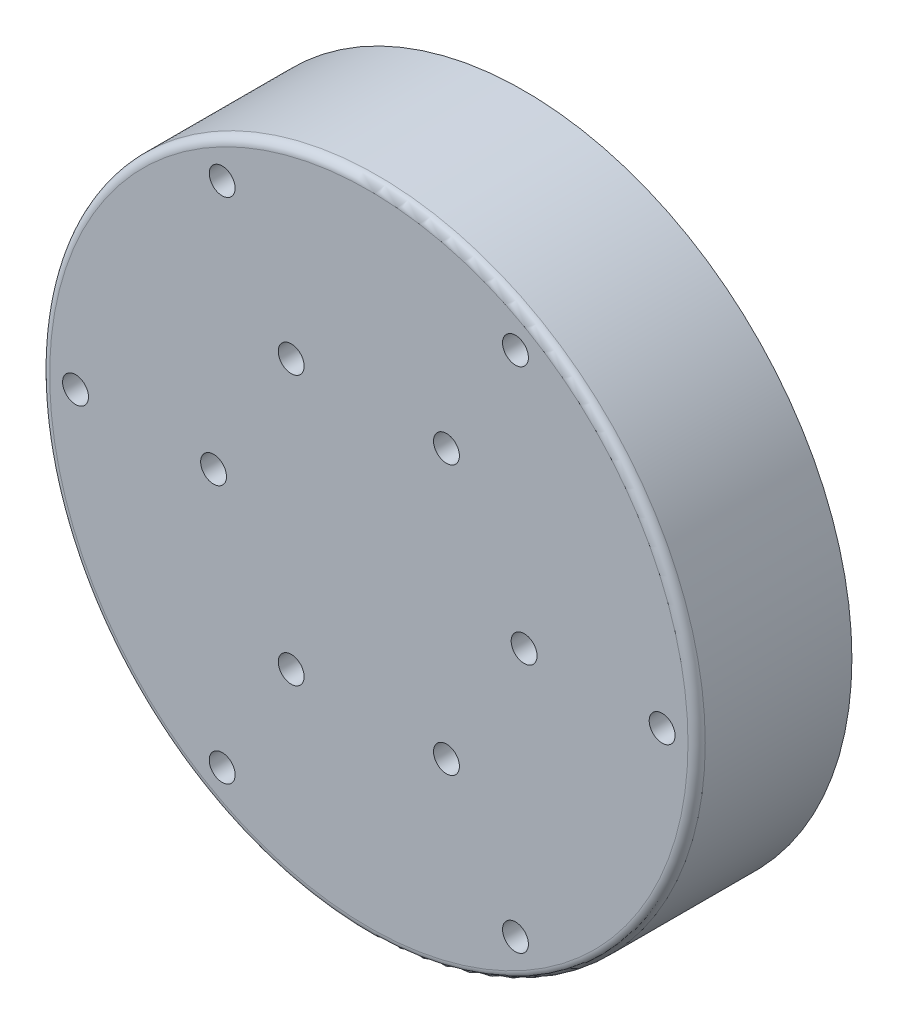
ISO-10303-21;
HEADER;
FILE_DESCRIPTION(('STEP AP214'),'2;1');
FILE_NAME('part.step','',(''),(''),'','','');
FILE_SCHEMA(('AUTOMOTIVE_DESIGN { 1 0 10303 214 1 1 1 1 }'));
ENDSEC;
DATA;
#1=APPLICATION_CONTEXT('core data for automotive mechanical design processes');
#2=APPLICATION_PROTOCOL_DEFINITION('international standard','automotive_design',2000,#1);
#3=PRODUCT_CONTEXT('',#1,'mechanical');
#4=PRODUCT('Part','Part','',(#3));
#5=PRODUCT_RELATED_PRODUCT_CATEGORY('part','',(#4));
#6=PRODUCT_DEFINITION_FORMATION('','',#4);
#7=PRODUCT_DEFINITION_CONTEXT('part definition',#1,'design');
#8=PRODUCT_DEFINITION('design','',#6,#7);
#9=PRODUCT_DEFINITION_SHAPE('','',#8);
#10=(LENGTH_UNIT() NAMED_UNIT(*) SI_UNIT(.MILLI.,.METRE.));
#11=(NAMED_UNIT(*) PLANE_ANGLE_UNIT() SI_UNIT($,.RADIAN.));
#12=(NAMED_UNIT(*) SI_UNIT($,.STERADIAN.) SOLID_ANGLE_UNIT());
#13=UNCERTAINTY_MEASURE_WITH_UNIT(LENGTH_MEASURE(1.E-05),#10,'distance_accuracy_value','');
#14=(GEOMETRIC_REPRESENTATION_CONTEXT(3) GLOBAL_UNCERTAINTY_ASSIGNED_CONTEXT((#13)) GLOBAL_UNIT_ASSIGNED_CONTEXT((#10,
#11,#12)) REPRESENTATION_CONTEXT('',''));
#15=CARTESIAN_POINT('',(0.,0.,0.));
#16=DIRECTION('',(0.,0.,1.));
#17=DIRECTION('',(1.,0.,0.));
#18=AXIS2_PLACEMENT_3D('',#15,#16,#17);
#19=CARTESIAN_POINT('',(0.,0.,18.));
#20=DIRECTION('',(0.,0.,-1.));
#21=DIRECTION('',(-1.,0.,0.));
#22=AXIS2_PLACEMENT_3D('',#19,#20,#21);
#23=CYLINDRICAL_SURFACE('',#22,38.);
#24=CARTESIAN_POINT('',(0.,0.,12.5));
#25=DIRECTION('',(0.,0.,1.));
#26=DIRECTION('',(1.,0.,0.));
#27=AXIS2_PLACEMENT_3D('',#24,#25,#26);
#28=CIRCLE('',#27,38.);
#29=CARTESIAN_POINT('',(10.,-36.6606055596467,12.5));
#30=VERTEX_POINT('',#29);
#31=CARTESIAN_POINT('',(-10.,-36.6606055596467,12.5));
#32=VERTEX_POINT('',#31);
#33=EDGE_CURVE('E110',#30,#32,#28,.F.);
#34=ORIENTED_EDGE('',*,*,#33,.F.);
#35=DIRECTION('',(0.,0.,-1.));
#36=VECTOR('',#35,1.);
#37=CARTESIAN_POINT('',(10.,-36.6606055596467,18.));
#38=LINE('',#37,#36);
#39=CARTESIAN_POINT('',(10.,-36.6606055596467,8.5));
#40=VERTEX_POINT('',#39);
#41=EDGE_CURVE('E92',#40,#30,#38,.F.);
#42=ORIENTED_EDGE('',*,*,#41,.F.);
#43=CARTESIAN_POINT('',(0.,0.,8.49999999999999));
#44=DIRECTION('',(0.,0.,-1.));
#45=DIRECTION('',(-1.,0.,0.));
#46=AXIS2_PLACEMENT_3D('',#43,#44,#45);
#47=CIRCLE('',#46,38.);
#48=CARTESIAN_POINT('',(-10.,-36.6606055596467,8.49999999999999));
#49=VERTEX_POINT('',#48);
#50=EDGE_CURVE('E102',#49,#40,#47,.F.);
#51=ORIENTED_EDGE('',*,*,#50,.F.);
#52=DIRECTION('',(0.,0.,-1.));
#53=VECTOR('',#52,1.);
#54=CARTESIAN_POINT('',(-10.,-36.6606055596467,18.));
#55=LINE('',#54,#53);
#56=EDGE_CURVE('E51',#32,#49,#55,.T.);
#57=ORIENTED_EDGE('',*,*,#56,.F.);
#58=EDGE_LOOP('',(#34,#42,#51,#57));
#59=FACE_BOUND('',#58,.T.);
#60=CARTESIAN_POINT('',(0.,0.,17.));
#61=DIRECTION('',(0.,0.,1.));
#62=DIRECTION('',(1.,0.,0.));
#63=AXIS2_PLACEMENT_3D('',#60,#61,#62);
#64=CIRCLE('',#63,38.);
#65=CARTESIAN_POINT('',(38.,0.,17.));
#66=VERTEX_POINT('',#65);
#67=EDGE_CURVE('E11',#66,#66,#64,.F.);
#68=ORIENTED_EDGE('',*,*,#67,.T.);
#69=EDGE_LOOP('',(#68));
#70=FACE_BOUND('',#69,.T.);
#71=CARTESIAN_POINT('',(0.,0.,0.));
#72=DIRECTION('',(0.,0.,1.));
#73=DIRECTION('',(1.,0.,0.));
#74=AXIS2_PLACEMENT_3D('',#71,#72,#73);
#75=CIRCLE('',#74,38.);
#76=CARTESIAN_POINT('',(38.,0.,0.));
#77=VERTEX_POINT('',#76);
#78=EDGE_CURVE('E147',#77,#77,#75,.T.);
#79=ORIENTED_EDGE('',*,*,#78,.T.);
#80=EDGE_LOOP('',(#79));
#81=FACE_BOUND('',#80,.T.);
#82=ADVANCED_FACE('F36',(#59,#70,#81),#23,.T.);
#83=CARTESIAN_POINT('',(0.,0.,18.));
#84=DIRECTION('',(0.,0.,1.));
#85=DIRECTION('',(1.,0.,0.));
#86=AXIS2_PLACEMENT_3D('',#83,#84,#85);
#87=PLANE('',#86);
#88=CARTESIAN_POINT('',(-18.,0.,18.));
#89=DIRECTION('',(0.,0.,1.));
#90=DIRECTION('',(1.,0.,0.));
#91=AXIS2_PLACEMENT_3D('',#88,#89,#90);
#92=CIRCLE('',#91,1.5);
#93=CARTESIAN_POINT('',(-16.5,0.,18.));
#94=VERTEX_POINT('',#93);
#95=EDGE_CURVE('E273',#94,#94,#92,.T.);
#96=ORIENTED_EDGE('',*,*,#95,.F.);
#97=EDGE_LOOP('',(#96));
#98=FACE_BOUND('',#97,.T.);
#99=CARTESIAN_POINT('',(-9.00000000000018,-15.5884572681198,18.));
#100=DIRECTION('',(0.,0.,1.));
#101=DIRECTION('',(1.,0.,0.));
#102=AXIS2_PLACEMENT_3D('',#99,#100,#101);
#103=CIRCLE('',#102,1.5);
#104=CARTESIAN_POINT('',(-7.50000000000018,-15.5884572681198,18.));
#105=VERTEX_POINT('',#104);
#106=EDGE_CURVE('E278',#105,#105,#103,.T.);
#107=ORIENTED_EDGE('',*,*,#106,.F.);
#108=EDGE_LOOP('',(#107));
#109=FACE_BOUND('',#108,.T.);
#110=CARTESIAN_POINT('',(8.99999999999985,-15.58845726812,18.));
#111=DIRECTION('',(0.,0.,1.));
#112=DIRECTION('',(1.,0.,0.));
#113=AXIS2_PLACEMENT_3D('',#110,#111,#112);
#114=CIRCLE('',#113,1.5);
#115=CARTESIAN_POINT('',(10.4999999999999,-15.58845726812,18.));
#116=VERTEX_POINT('',#115);
#117=EDGE_CURVE('E302',#116,#116,#114,.T.);
#118=ORIENTED_EDGE('',*,*,#117,.F.);
#119=EDGE_LOOP('',(#118));
#120=FACE_BOUND('',#119,.T.);
#121=CARTESIAN_POINT('',(18.,-1.25693328198353E-13,18.));
#122=DIRECTION('',(0.,0.,1.));
#123=DIRECTION('',(1.,0.,0.));
#124=AXIS2_PLACEMENT_3D('',#121,#122,#123);
#125=CIRCLE('',#124,1.5);
#126=CARTESIAN_POINT('',(19.5,-1.25693328198353E-13,18.));
#127=VERTEX_POINT('',#126);
#128=EDGE_CURVE('E296',#127,#127,#125,.T.);
#129=ORIENTED_EDGE('',*,*,#128,.F.);
#130=EDGE_LOOP('',(#129));
#131=FACE_BOUND('',#130,.T.);
#132=CARTESIAN_POINT('',(9.00000000000007,15.5884572681199,18.));
#133=DIRECTION('',(0.,0.,1.));
#134=DIRECTION('',(1.,0.,0.));
#135=AXIS2_PLACEMENT_3D('',#132,#133,#134);
#136=CIRCLE('',#135,1.5);
#137=CARTESIAN_POINT('',(10.5000000000001,15.5884572681199,18.));
#138=VERTEX_POINT('',#137);
#139=EDGE_CURVE('E290',#138,#138,#136,.T.);
#140=ORIENTED_EDGE('',*,*,#139,.F.);
#141=EDGE_LOOP('',(#140));
#142=FACE_BOUND('',#141,.T.);
#143=CARTESIAN_POINT('',(-8.99999999999996,15.5884572681199,18.));
#144=DIRECTION('',(0.,0.,1.));
#145=DIRECTION('',(1.,0.,0.));
#146=AXIS2_PLACEMENT_3D('',#143,#144,#145);
#147=CIRCLE('',#146,1.5);
#148=CARTESIAN_POINT('',(-7.49999999999996,15.5884572681199,18.));
#149=VERTEX_POINT('',#148);
#150=EDGE_CURVE('E275',#149,#149,#147,.T.);
#151=ORIENTED_EDGE('',*,*,#150,.F.);
#152=EDGE_LOOP('',(#151));
#153=FACE_BOUND('',#152,.T.);
#154=CARTESIAN_POINT('',(0.,0.,18.));
#155=DIRECTION('',(0.,0.,1.));
#156=DIRECTION('',(1.,0.,0.));
#157=AXIS2_PLACEMENT_3D('',#154,#155,#156);
#158=CIRCLE('',#157,37.);
#159=CARTESIAN_POINT('',(37.,0.,18.));
#160=VERTEX_POINT('',#159);
#161=EDGE_CURVE('E44',#160,#160,#158,.T.);
#162=ORIENTED_EDGE('',*,*,#161,.T.);
#163=EDGE_LOOP('',(#162));
#164=FACE_BOUND('',#163,.T.);
#165=CARTESIAN_POINT('',(34.,-2.37420731041333E-13,18.));
#166=DIRECTION('',(0.,0.,1.));
#167=DIRECTION('',(1.,0.,0.));
#168=AXIS2_PLACEMENT_3D('',#165,#166,#167);
#169=CIRCLE('',#168,1.5);
#170=CARTESIAN_POINT('',(35.5,-2.37420731041333E-13,18.));
#171=VERTEX_POINT('',#170);
#172=EDGE_CURVE('E140',#171,#171,#169,.T.);
#173=ORIENTED_EDGE('',*,*,#172,.F.);
#174=EDGE_LOOP('',(#173));
#175=FACE_BOUND('',#174,.T.);
#176=CARTESIAN_POINT('',(16.9999999999997,-29.4448637286711,18.));
#177=DIRECTION('',(0.,0.,1.));
#178=DIRECTION('',(1.,0.,0.));
#179=AXIS2_PLACEMENT_3D('',#176,#177,#178);
#180=CIRCLE('',#179,1.5);
#181=CARTESIAN_POINT('',(18.4999999999997,-29.4448637286711,18.));
#182=VERTEX_POINT('',#181);
#183=EDGE_CURVE('E150',#182,#182,#180,.T.);
#184=ORIENTED_EDGE('',*,*,#183,.F.);
#185=EDGE_LOOP('',(#184));
#186=FACE_BOUND('',#185,.T.);
#187=CARTESIAN_POINT('',(-17.0000000000004,-29.4448637286707,18.));
#188=DIRECTION('',(0.,0.,1.));
#189=DIRECTION('',(1.,0.,0.));
#190=AXIS2_PLACEMENT_3D('',#187,#188,#189);
#191=CIRCLE('',#190,1.49999999999998);
#192=CARTESIAN_POINT('',(-15.5000000000004,-29.4448637286707,18.));
#193=VERTEX_POINT('',#192);
#194=EDGE_CURVE('E169',#193,#193,#191,.T.);
#195=ORIENTED_EDGE('',*,*,#194,.F.);
#196=EDGE_LOOP('',(#195));
#197=FACE_BOUND('',#196,.T.);
#198=CARTESIAN_POINT('',(-34.,0.,18.));
#199=DIRECTION('',(0.,0.,1.));
#200=DIRECTION('',(1.,0.,0.));
#201=AXIS2_PLACEMENT_3D('',#198,#199,#200);
#202=CIRCLE('',#201,1.5);
#203=CARTESIAN_POINT('',(-32.5,0.,18.));
#204=VERTEX_POINT('',#203);
#205=EDGE_CURVE('E163',#204,#204,#202,.T.);
#206=ORIENTED_EDGE('',*,*,#205,.F.);
#207=EDGE_LOOP('',(#206));
#208=FACE_BOUND('',#207,.T.);
#209=CARTESIAN_POINT('',(-16.9999999999999,29.444863728671,18.));
#210=DIRECTION('',(0.,0.,1.));
#211=DIRECTION('',(1.,0.,0.));
#212=AXIS2_PLACEMENT_3D('',#209,#210,#211);
#213=CIRCLE('',#212,1.5);
#214=CARTESIAN_POINT('',(-15.4999999999999,29.444863728671,18.));
#215=VERTEX_POINT('',#214);
#216=EDGE_CURVE('E157',#215,#215,#213,.T.);
#217=ORIENTED_EDGE('',*,*,#216,.F.);
#218=EDGE_LOOP('',(#217));
#219=FACE_BOUND('',#218,.T.);
#220=CARTESIAN_POINT('',(17.0000000000001,29.4448637286708,18.));
#221=DIRECTION('',(0.,0.,1.));
#222=DIRECTION('',(1.,0.,0.));
#223=AXIS2_PLACEMENT_3D('',#220,#221,#222);
#224=CIRCLE('',#223,1.5);
#225=CARTESIAN_POINT('',(18.5000000000001,29.4448637286708,18.));
#226=VERTEX_POINT('',#225);
#227=EDGE_CURVE('E144',#226,#226,#224,.T.);
#228=ORIENTED_EDGE('',*,*,#227,.F.);
#229=EDGE_LOOP('',(#228));
#230=FACE_BOUND('',#229,.T.);
#231=ADVANCED_FACE('F180',(#98,#109,#120,#131,#142,#153,#164,#175,#186,#197,#208,#219,#230),#87,.T.);
#232=CARTESIAN_POINT('',(0.,0.,0.));
#233=DIRECTION('',(0.,0.,1.));
#234=DIRECTION('',(1.,0.,0.));
#235=AXIS2_PLACEMENT_3D('',#232,#233,#234);
#236=PLANE('',#235);
#237=DIRECTION('',(-1.,0.,0.));
#238=VECTOR('',#237,1.);
#239=CARTESIAN_POINT('',(13.076696830622,-27.,0.));
#240=LINE('',#239,#238);
#241=CARTESIAN_POINT('',(13.076696830622,-27.,0.));
#242=VERTEX_POINT('',#241);
#243=CARTESIAN_POINT('',(-13.076696830622,-27.,0.));
#244=VERTEX_POINT('',#243);
#245=EDGE_CURVE('E127',#242,#244,#240,.T.);
#246=ORIENTED_EDGE('',*,*,#245,.F.);
#247=CARTESIAN_POINT('',(0.,0.,0.));
#248=DIRECTION('',(0.,0.,-1.));
#249=DIRECTION('',(-1.,0.,0.));
#250=AXIS2_PLACEMENT_3D('',#247,#248,#249);
#251=CIRCLE('',#250,30.);
#252=EDGE_CURVE('E105',#244,#242,#251,.T.);
#253=ORIENTED_EDGE('',*,*,#252,.F.);
#254=EDGE_LOOP('',(#246,#253));
#255=FACE_BOUND('',#254,.T.);
#256=CARTESIAN_POINT('',(34.,-2.37420731041333E-13,0.));
#257=DIRECTION('',(0.,0.,1.));
#258=DIRECTION('',(1.,0.,0.));
#259=AXIS2_PLACEMENT_3D('',#256,#257,#258);
#260=CIRCLE('',#259,1.5);
#261=CARTESIAN_POINT('',(35.5,-2.37420731041333E-13,0.));
#262=VERTEX_POINT('',#261);
#263=EDGE_CURVE('E143',#262,#262,#260,.F.);
#264=ORIENTED_EDGE('',*,*,#263,.F.);
#265=EDGE_LOOP('',(#264));
#266=FACE_BOUND('',#265,.T.);
#267=CARTESIAN_POINT('',(16.9999999999997,-29.4448637286711,0.));
#268=DIRECTION('',(0.,0.,1.));
#269=DIRECTION('',(1.,0.,0.));
#270=AXIS2_PLACEMENT_3D('',#267,#268,#269);
#271=CIRCLE('',#270,1.5);
#272=CARTESIAN_POINT('',(18.4999999999997,-29.4448637286711,0.));
#273=VERTEX_POINT('',#272);
#274=EDGE_CURVE('E137',#273,#273,#271,.F.);
#275=ORIENTED_EDGE('',*,*,#274,.F.);
#276=EDGE_LOOP('',(#275));
#277=FACE_BOUND('',#276,.T.);
#278=CARTESIAN_POINT('',(-17.0000000000004,-29.4448637286707,0.));
#279=DIRECTION('',(0.,0.,1.));
#280=DIRECTION('',(1.,0.,0.));
#281=AXIS2_PLACEMENT_3D('',#278,#279,#280);
#282=CIRCLE('',#281,1.49999999999998);
#283=CARTESIAN_POINT('',(-15.5000000000004,-29.4448637286707,0.));
#284=VERTEX_POINT('',#283);
#285=EDGE_CURVE('E153',#284,#284,#282,.F.);
#286=ORIENTED_EDGE('',*,*,#285,.F.);
#287=EDGE_LOOP('',(#286));
#288=FACE_BOUND('',#287,.T.);
#289=CARTESIAN_POINT('',(-34.,0.,0.));
#290=DIRECTION('',(0.,0.,1.));
#291=DIRECTION('',(1.,0.,0.));
#292=AXIS2_PLACEMENT_3D('',#289,#290,#291);
#293=CIRCLE('',#292,1.5);
#294=CARTESIAN_POINT('',(-32.5,0.,0.));
#295=VERTEX_POINT('',#294);
#296=EDGE_CURVE('E166',#295,#295,#293,.F.);
#297=ORIENTED_EDGE('',*,*,#296,.F.);
#298=EDGE_LOOP('',(#297));
#299=FACE_BOUND('',#298,.T.);
#300=CARTESIAN_POINT('',(-16.9999999999999,29.444863728671,0.));
#301=DIRECTION('',(0.,0.,1.));
#302=DIRECTION('',(1.,0.,0.));
#303=AXIS2_PLACEMENT_3D('',#300,#301,#302);
#304=CIRCLE('',#303,1.5);
#305=CARTESIAN_POINT('',(-15.4999999999999,29.444863728671,0.));
#306=VERTEX_POINT('',#305);
#307=EDGE_CURVE('E160',#306,#306,#304,.F.);
#308=ORIENTED_EDGE('',*,*,#307,.F.);
#309=EDGE_LOOP('',(#308));
#310=FACE_BOUND('',#309,.T.);
#311=CARTESIAN_POINT('',(17.0000000000001,29.4448637286708,0.));
#312=DIRECTION('',(0.,0.,1.));
#313=DIRECTION('',(1.,0.,0.));
#314=AXIS2_PLACEMENT_3D('',#311,#312,#313);
#315=CIRCLE('',#314,1.5);
#316=CARTESIAN_POINT('',(18.5000000000001,29.4448637286708,0.));
#317=VERTEX_POINT('',#316);
#318=EDGE_CURVE('E154',#317,#317,#315,.F.);
#319=ORIENTED_EDGE('',*,*,#318,.F.);
#320=EDGE_LOOP('',(#319));
#321=FACE_BOUND('',#320,.T.);
#322=ORIENTED_EDGE('',*,*,#78,.F.);
#323=EDGE_LOOP('',(#322));
#324=FACE_BOUND('',#323,.T.);
#325=ADVANCED_FACE('F200',(#255,#266,#277,#288,#299,#310,#321,#324),#236,.F.);
#326=CARTESIAN_POINT('',(17.0000000000001,29.4448637286708,-0.001000000000001));
#327=DIRECTION('',(0.,0.,1.));
#328=DIRECTION('',(1.,0.,0.));
#329=AXIS2_PLACEMENT_3D('',#326,#327,#328);
#330=CYLINDRICAL_SURFACE('',#329,1.5);
#331=ORIENTED_EDGE('',*,*,#227,.T.);
#332=EDGE_LOOP('',(#331));
#333=FACE_BOUND('',#332,.T.);
#334=ORIENTED_EDGE('',*,*,#318,.T.);
#335=EDGE_LOOP('',(#334));
#336=FACE_BOUND('',#335,.T.);
#337=ADVANCED_FACE('F205',(#333,#336),#330,.F.);
#338=CARTESIAN_POINT('',(-16.9999999999999,29.444863728671,-0.001000000000001));
#339=DIRECTION('',(0.,0.,1.));
#340=DIRECTION('',(1.,0.,0.));
#341=AXIS2_PLACEMENT_3D('',#338,#339,#340);
#342=CYLINDRICAL_SURFACE('',#341,1.5);
#343=ORIENTED_EDGE('',*,*,#216,.T.);
#344=EDGE_LOOP('',(#343));
#345=FACE_BOUND('',#344,.T.);
#346=ORIENTED_EDGE('',*,*,#307,.T.);
#347=EDGE_LOOP('',(#346));
#348=FACE_BOUND('',#347,.T.);
#349=ADVANCED_FACE('F216',(#345,#348),#342,.F.);
#350=CARTESIAN_POINT('',(-34.,0.,-0.001000000000001));
#351=DIRECTION('',(0.,0.,1.));
#352=DIRECTION('',(1.,0.,0.));
#353=AXIS2_PLACEMENT_3D('',#350,#351,#352);
#354=CYLINDRICAL_SURFACE('',#353,1.5);
#355=ORIENTED_EDGE('',*,*,#205,.T.);
#356=EDGE_LOOP('',(#355));
#357=FACE_BOUND('',#356,.T.);
#358=ORIENTED_EDGE('',*,*,#296,.T.);
#359=EDGE_LOOP('',(#358));
#360=FACE_BOUND('',#359,.T.);
#361=ADVANCED_FACE('F212',(#357,#360),#354,.F.);
#362=CARTESIAN_POINT('',(-17.0000000000004,-29.4448637286707,-0.001000000000001));
#363=DIRECTION('',(0.,0.,1.));
#364=DIRECTION('',(1.,0.,0.));
#365=AXIS2_PLACEMENT_3D('',#362,#363,#364);
#366=CYLINDRICAL_SURFACE('',#365,1.49999999999998);
#367=ORIENTED_EDGE('',*,*,#194,.T.);
#368=EDGE_LOOP('',(#367));
#369=FACE_BOUND('',#368,.T.);
#370=ORIENTED_EDGE('',*,*,#285,.T.);
#371=EDGE_LOOP('',(#370));
#372=FACE_BOUND('',#371,.T.);
#373=ADVANCED_FACE('F208',(#369,#372),#366,.F.);
#374=CARTESIAN_POINT('',(16.9999999999997,-29.4448637286711,-0.001000000000001));
#375=DIRECTION('',(0.,0.,1.));
#376=DIRECTION('',(1.,0.,0.));
#377=AXIS2_PLACEMENT_3D('',#374,#375,#376);
#378=CYLINDRICAL_SURFACE('',#377,1.5);
#379=ORIENTED_EDGE('',*,*,#183,.T.);
#380=EDGE_LOOP('',(#379));
#381=FACE_BOUND('',#380,.T.);
#382=ORIENTED_EDGE('',*,*,#274,.T.);
#383=EDGE_LOOP('',(#382));
#384=FACE_BOUND('',#383,.T.);
#385=ADVANCED_FACE('F211',(#381,#384),#378,.F.);
#386=CARTESIAN_POINT('',(34.,-2.37420731041333E-13,-0.001000000000001));
#387=DIRECTION('',(0.,0.,1.));
#388=DIRECTION('',(1.,0.,0.));
#389=AXIS2_PLACEMENT_3D('',#386,#387,#388);
#390=CYLINDRICAL_SURFACE('',#389,1.5);
#391=ORIENTED_EDGE('',*,*,#172,.T.);
#392=EDGE_LOOP('',(#391));
#393=FACE_BOUND('',#392,.T.);
#394=ORIENTED_EDGE('',*,*,#263,.T.);
#395=EDGE_LOOP('',(#394));
#396=FACE_BOUND('',#395,.T.);
#397=ADVANCED_FACE('F226',(#393,#396),#390,.F.);
#398=CARTESIAN_POINT('',(0.,0.,12.5));
#399=DIRECTION('',(0.,0.,-1.));
#400=DIRECTION('',(-1.,0.,0.));
#401=AXIS2_PLACEMENT_3D('',#398,#399,#400);
#402=CYLINDRICAL_SURFACE('',#401,30.);
#403=ORIENTED_EDGE('',*,*,#252,.T.);
#404=DIRECTION('',(0.,0.,-1.));
#405=VECTOR('',#404,1.);
#406=CARTESIAN_POINT('',(13.076696830622,-27.,12.5));
#407=LINE('',#406,#405);
#408=CARTESIAN_POINT('',(13.076696830622,-27.,12.5));
#409=VERTEX_POINT('',#408);
#410=EDGE_CURVE('E131',#409,#242,#407,.T.);
#411=ORIENTED_EDGE('',*,*,#410,.F.);
#412=CARTESIAN_POINT('',(0.,0.,12.5));
#413=DIRECTION('',(0.,0.,-1.));
#414=DIRECTION('',(-1.,0.,0.));
#415=AXIS2_PLACEMENT_3D('',#412,#413,#414);
#416=CIRCLE('',#415,30.);
#417=CARTESIAN_POINT('',(-13.076696830622,-27.,12.5));
#418=VERTEX_POINT('',#417);
#419=EDGE_CURVE('E123',#418,#409,#416,.T.);
#420=ORIENTED_EDGE('',*,*,#419,.F.);
#421=DIRECTION('',(0.,0.,-1.));
#422=VECTOR('',#421,1.);
#423=CARTESIAN_POINT('',(-13.076696830622,-27.,12.5));
#424=LINE('',#423,#422);
#425=EDGE_CURVE('E135',#418,#244,#424,.T.);
#426=ORIENTED_EDGE('',*,*,#425,.T.);
#427=EDGE_LOOP('',(#403,#411,#420,#426));
#428=FACE_BOUND('',#427,.T.);
#429=ADVANCED_FACE('F230',(#428),#402,.F.);
#430=CARTESIAN_POINT('',(13.076696830622,-27.,12.5));
#431=DIRECTION('',(0.,-1.,0.));
#432=DIRECTION('',(0.,0.,-1.));
#433=AXIS2_PLACEMENT_3D('',#430,#431,#432);
#434=PLANE('',#433);
#435=DIRECTION('',(-1.,0.,0.));
#436=VECTOR('',#435,1.);
#437=CARTESIAN_POINT('',(-10.,-27.,8.49999999999999));
#438=LINE('',#437,#436);
#439=CARTESIAN_POINT('',(10.,-27.,8.5));
#440=VERTEX_POINT('',#439);
#441=CARTESIAN_POINT('',(-10.,-27.,8.49999999999999));
#442=VERTEX_POINT('',#441);
#443=EDGE_CURVE('E112',#440,#442,#438,.T.);
#444=ORIENTED_EDGE('',*,*,#443,.F.);
#445=DIRECTION('',(0.,0.,-1.));
#446=VECTOR('',#445,1.);
#447=CARTESIAN_POINT('',(10.,-27.,8.5));
#448=LINE('',#447,#446);
#449=CARTESIAN_POINT('',(10.,-27.,12.5));
#450=VERTEX_POINT('',#449);
#451=EDGE_CURVE('E95',#450,#440,#448,.T.);
#452=ORIENTED_EDGE('',*,*,#451,.F.);
#453=DIRECTION('',(-1.,0.,0.));
#454=VECTOR('',#453,1.);
#455=CARTESIAN_POINT('',(13.076696830622,-27.,12.5));
#456=LINE('',#455,#454);
#457=EDGE_CURVE('E128',#409,#450,#456,.T.);
#458=ORIENTED_EDGE('',*,*,#457,.F.);
#459=ORIENTED_EDGE('',*,*,#410,.T.);
#460=ORIENTED_EDGE('',*,*,#245,.T.);
#461=ORIENTED_EDGE('',*,*,#425,.F.);
#462=CARTESIAN_POINT('',(-10.,-27.,12.5));
#463=VERTEX_POINT('',#462);
#464=EDGE_CURVE('E126',#463,#418,#456,.T.);
#465=ORIENTED_EDGE('',*,*,#464,.F.);
#466=DIRECTION('',(0.,0.,1.));
#467=VECTOR('',#466,1.);
#468=CARTESIAN_POINT('',(-10.,-27.,8.49999999999999));
#469=LINE('',#468,#467);
#470=EDGE_CURVE('E56',#442,#463,#469,.T.);
#471=ORIENTED_EDGE('',*,*,#470,.F.);
#472=EDGE_LOOP('',(#444,#452,#458,#459,#460,#461,#465,#471));
#473=FACE_BOUND('',#472,.T.);
#474=ADVANCED_FACE('F192',(#473),#434,.F.);
#475=CARTESIAN_POINT('',(0.,0.,12.5));
#476=DIRECTION('',(0.,0.,-1.));
#477=DIRECTION('',(-1.,0.,0.));
#478=AXIS2_PLACEMENT_3D('',#475,#476,#477);
#479=PLANE('',#478);
#480=CARTESIAN_POINT('',(-18.,0.,12.5));
#481=DIRECTION('',(0.,0.,-1.));
#482=DIRECTION('',(-1.,0.,0.));
#483=AXIS2_PLACEMENT_3D('',#480,#481,#482);
#484=CIRCLE('',#483,1.5);
#485=CARTESIAN_POINT('',(-19.5,0.,12.5));
#486=VERTEX_POINT('',#485);
#487=EDGE_CURVE('E270',#486,#486,#484,.F.);
#488=ORIENTED_EDGE('',*,*,#487,.T.);
#489=EDGE_LOOP('',(#488));
#490=FACE_BOUND('',#489,.T.);
#491=CARTESIAN_POINT('',(-9.00000000000018,-15.5884572681198,12.5));
#492=DIRECTION('',(0.,0.,-1.));
#493=DIRECTION('',(-1.,0.,0.));
#494=AXIS2_PLACEMENT_3D('',#491,#492,#493);
#495=CIRCLE('',#494,1.5);
#496=CARTESIAN_POINT('',(-10.5000000000002,-15.5884572681198,12.5));
#497=VERTEX_POINT('',#496);
#498=EDGE_CURVE('E282',#497,#497,#495,.F.);
#499=ORIENTED_EDGE('',*,*,#498,.T.);
#500=EDGE_LOOP('',(#499));
#501=FACE_BOUND('',#500,.T.);
#502=CARTESIAN_POINT('',(8.99999999999985,-15.58845726812,12.5));
#503=DIRECTION('',(0.,0.,-1.));
#504=DIRECTION('',(-1.,0.,0.));
#505=AXIS2_PLACEMENT_3D('',#502,#503,#504);
#506=CIRCLE('',#505,1.5);
#507=CARTESIAN_POINT('',(7.49999999999985,-15.58845726812,12.5));
#508=VERTEX_POINT('',#507);
#509=EDGE_CURVE('E281',#508,#508,#506,.F.);
#510=ORIENTED_EDGE('',*,*,#509,.T.);
#511=EDGE_LOOP('',(#510));
#512=FACE_BOUND('',#511,.T.);
#513=CARTESIAN_POINT('',(18.,-1.25693328198353E-13,12.5));
#514=DIRECTION('',(0.,0.,-1.));
#515=DIRECTION('',(-1.,0.,0.));
#516=AXIS2_PLACEMENT_3D('',#513,#514,#515);
#517=CIRCLE('',#516,1.5);
#518=CARTESIAN_POINT('',(16.5,-1.25693328198353E-13,12.5));
#519=VERTEX_POINT('',#518);
#520=EDGE_CURVE('E299',#519,#519,#517,.F.);
#521=ORIENTED_EDGE('',*,*,#520,.T.);
#522=EDGE_LOOP('',(#521));
#523=FACE_BOUND('',#522,.T.);
#524=CARTESIAN_POINT('',(9.00000000000007,15.5884572681199,12.5));
#525=DIRECTION('',(0.,0.,-1.));
#526=DIRECTION('',(-1.,0.,0.));
#527=AXIS2_PLACEMENT_3D('',#524,#525,#526);
#528=CIRCLE('',#527,1.5);
#529=CARTESIAN_POINT('',(7.50000000000007,15.5884572681199,12.5));
#530=VERTEX_POINT('',#529);
#531=EDGE_CURVE('E293',#530,#530,#528,.F.);
#532=ORIENTED_EDGE('',*,*,#531,.T.);
#533=EDGE_LOOP('',(#532));
#534=FACE_BOUND('',#533,.T.);
#535=CARTESIAN_POINT('',(-8.99999999999996,15.5884572681199,12.5));
#536=DIRECTION('',(0.,0.,-1.));
#537=DIRECTION('',(-1.,0.,0.));
#538=AXIS2_PLACEMENT_3D('',#535,#536,#537);
#539=CIRCLE('',#538,1.5);
#540=CARTESIAN_POINT('',(-10.5,15.5884572681199,12.5));
#541=VERTEX_POINT('',#540);
#542=EDGE_CURVE('E287',#541,#541,#539,.F.);
#543=ORIENTED_EDGE('',*,*,#542,.T.);
#544=EDGE_LOOP('',(#543));
#545=FACE_BOUND('',#544,.T.);
#546=ORIENTED_EDGE('',*,*,#419,.T.);
#547=ORIENTED_EDGE('',*,*,#457,.T.);
#548=DIRECTION('',(0.,1.,0.));
#549=VECTOR('',#548,1.);
#550=CARTESIAN_POINT('',(10.,-38.001,12.5));
#551=LINE('',#550,#549);
#552=EDGE_CURVE('E106',#30,#450,#551,.T.);
#553=ORIENTED_EDGE('',*,*,#552,.F.);
#554=ORIENTED_EDGE('',*,*,#33,.T.);
#555=DIRECTION('',(0.,1.,0.));
#556=VECTOR('',#555,1.);
#557=CARTESIAN_POINT('',(-10.,-38.001,12.5));
#558=LINE('',#557,#556);
#559=EDGE_CURVE('E120',#32,#463,#558,.T.);
#560=ORIENTED_EDGE('',*,*,#559,.T.);
#561=ORIENTED_EDGE('',*,*,#464,.T.);
#562=EDGE_LOOP('',(#546,#547,#553,#554,#560,#561));
#563=FACE_BOUND('',#562,.T.);
#564=ADVANCED_FACE('F184',(#490,#501,#512,#523,#534,#545,#563),#479,.T.);
#565=CARTESIAN_POINT('',(0.,0.,17.));
#566=DIRECTION('',(0.,0.,1.));
#567=DIRECTION('',(1.,0.,0.));
#568=AXIS2_PLACEMENT_3D('',#565,#566,#567);
#569=TOROIDAL_SURFACE('',#568,37.,1.);
#570=ORIENTED_EDGE('',*,*,#67,.F.);
#571=EDGE_LOOP('',(#570));
#572=FACE_BOUND('',#571,.T.);
#573=ORIENTED_EDGE('',*,*,#161,.F.);
#574=EDGE_LOOP('',(#573));
#575=FACE_BOUND('',#574,.T.);
#576=ADVANCED_FACE('F38',(#572,#575),#569,.T.);
#577=CARTESIAN_POINT('',(10.,-38.001,8.5));
#578=DIRECTION('',(1.,0.,0.));
#579=DIRECTION('',(0.,0.,-1.));
#580=AXIS2_PLACEMENT_3D('',#577,#578,#579);
#581=PLANE('',#580);
#582=ORIENTED_EDGE('',*,*,#41,.T.);
#583=ORIENTED_EDGE('',*,*,#552,.T.);
#584=ORIENTED_EDGE('',*,*,#451,.T.);
#585=DIRECTION('',(0.,1.,0.));
#586=VECTOR('',#585,1.);
#587=CARTESIAN_POINT('',(10.,-38.001,8.5));
#588=LINE('',#587,#586);
#589=EDGE_CURVE('E88',#40,#440,#588,.T.);
#590=ORIENTED_EDGE('',*,*,#589,.F.);
#591=EDGE_LOOP('',(#582,#583,#584,#590));
#592=FACE_BOUND('',#591,.T.);
#593=ADVANCED_FACE('F90',(#592),#581,.F.);
#594=CARTESIAN_POINT('',(-10.,-38.001,8.49999999999999));
#595=DIRECTION('',(-1.,0.,0.));
#596=DIRECTION('',(0.,0.,1.));
#597=AXIS2_PLACEMENT_3D('',#594,#595,#596);
#598=PLANE('',#597);
#599=ORIENTED_EDGE('',*,*,#56,.T.);
#600=DIRECTION('',(0.,1.,0.));
#601=VECTOR('',#600,1.);
#602=CARTESIAN_POINT('',(-10.,-38.001,8.49999999999999));
#603=LINE('',#602,#601);
#604=EDGE_CURVE('E99',#49,#442,#603,.T.);
#605=ORIENTED_EDGE('',*,*,#604,.T.);
#606=ORIENTED_EDGE('',*,*,#470,.T.);
#607=ORIENTED_EDGE('',*,*,#559,.F.);
#608=EDGE_LOOP('',(#599,#605,#606,#607));
#609=FACE_BOUND('',#608,.T.);
#610=ADVANCED_FACE('F190',(#609),#598,.F.);
#611=CARTESIAN_POINT('',(-10.,-38.001,8.49999999999999));
#612=DIRECTION('',(0.,0.,-1.));
#613=DIRECTION('',(-1.,0.,0.));
#614=AXIS2_PLACEMENT_3D('',#611,#612,#613);
#615=PLANE('',#614);
#616=ORIENTED_EDGE('',*,*,#50,.T.);
#617=ORIENTED_EDGE('',*,*,#589,.T.);
#618=ORIENTED_EDGE('',*,*,#443,.T.);
#619=ORIENTED_EDGE('',*,*,#604,.F.);
#620=EDGE_LOOP('',(#616,#617,#618,#619));
#621=FACE_BOUND('',#620,.T.);
#622=ADVANCED_FACE('F103',(#621),#615,.F.);
#623=CARTESIAN_POINT('',(-8.99999999999996,15.5884572681199,-0.001000000000001));
#624=DIRECTION('',(0.,0.,1.));
#625=DIRECTION('',(1.,0.,0.));
#626=AXIS2_PLACEMENT_3D('',#623,#624,#625);
#627=CYLINDRICAL_SURFACE('',#626,1.5);
#628=ORIENTED_EDGE('',*,*,#542,.F.);
#629=EDGE_LOOP('',(#628));
#630=FACE_BOUND('',#629,.T.);
#631=ORIENTED_EDGE('',*,*,#150,.T.);
#632=EDGE_LOOP('',(#631));
#633=FACE_BOUND('',#632,.T.);
#634=ADVANCED_FACE('F240',(#630,#633),#627,.F.);
#635=CARTESIAN_POINT('',(9.00000000000007,15.5884572681199,-0.001000000000001));
#636=DIRECTION('',(0.,0.,1.));
#637=DIRECTION('',(1.,0.,0.));
#638=AXIS2_PLACEMENT_3D('',#635,#636,#637);
#639=CYLINDRICAL_SURFACE('',#638,1.5);
#640=ORIENTED_EDGE('',*,*,#531,.F.);
#641=EDGE_LOOP('',(#640));
#642=FACE_BOUND('',#641,.T.);
#643=ORIENTED_EDGE('',*,*,#139,.T.);
#644=EDGE_LOOP('',(#643));
#645=FACE_BOUND('',#644,.T.);
#646=ADVANCED_FACE('F251',(#642,#645),#639,.F.);
#647=CARTESIAN_POINT('',(18.,-1.25693328198353E-13,-0.001000000000001));
#648=DIRECTION('',(0.,0.,1.));
#649=DIRECTION('',(1.,0.,0.));
#650=AXIS2_PLACEMENT_3D('',#647,#648,#649);
#651=CYLINDRICAL_SURFACE('',#650,1.5);
#652=ORIENTED_EDGE('',*,*,#520,.F.);
#653=EDGE_LOOP('',(#652));
#654=FACE_BOUND('',#653,.T.);
#655=ORIENTED_EDGE('',*,*,#128,.T.);
#656=EDGE_LOOP('',(#655));
#657=FACE_BOUND('',#656,.T.);
#658=ADVANCED_FACE('F247',(#654,#657),#651,.F.);
#659=CARTESIAN_POINT('',(8.99999999999985,-15.58845726812,-0.001000000000001));
#660=DIRECTION('',(0.,0.,1.));
#661=DIRECTION('',(1.,0.,0.));
#662=AXIS2_PLACEMENT_3D('',#659,#660,#661);
#663=CYLINDRICAL_SURFACE('',#662,1.5);
#664=ORIENTED_EDGE('',*,*,#509,.F.);
#665=EDGE_LOOP('',(#664));
#666=FACE_BOUND('',#665,.T.);
#667=ORIENTED_EDGE('',*,*,#117,.T.);
#668=EDGE_LOOP('',(#667));
#669=FACE_BOUND('',#668,.T.);
#670=ADVANCED_FACE('F243',(#666,#669),#663,.F.);
#671=CARTESIAN_POINT('',(-9.00000000000018,-15.5884572681198,-0.001000000000001));
#672=DIRECTION('',(0.,0.,1.));
#673=DIRECTION('',(1.,0.,0.));
#674=AXIS2_PLACEMENT_3D('',#671,#672,#673);
#675=CYLINDRICAL_SURFACE('',#674,1.5);
#676=ORIENTED_EDGE('',*,*,#498,.F.);
#677=EDGE_LOOP('',(#676));
#678=FACE_BOUND('',#677,.T.);
#679=ORIENTED_EDGE('',*,*,#106,.T.);
#680=EDGE_LOOP('',(#679));
#681=FACE_BOUND('',#680,.T.);
#682=ADVANCED_FACE('F246',(#678,#681),#675,.F.);
#683=CARTESIAN_POINT('',(-18.,0.,-0.001000000000001));
#684=DIRECTION('',(0.,0.,1.));
#685=DIRECTION('',(1.,0.,0.));
#686=AXIS2_PLACEMENT_3D('',#683,#684,#685);
#687=CYLINDRICAL_SURFACE('',#686,1.5);
#688=ORIENTED_EDGE('',*,*,#487,.F.);
#689=EDGE_LOOP('',(#688));
#690=FACE_BOUND('',#689,.T.);
#691=ORIENTED_EDGE('',*,*,#95,.T.);
#692=EDGE_LOOP('',(#691));
#693=FACE_BOUND('',#692,.T.);
#694=ADVANCED_FACE('F261',(#690,#693),#687,.F.);
#695=CLOSED_SHELL('',(#82,#231,#325,#337,#349,#361,#373,#385,#397,#429,#474,#564,#576,#593,#610,
#622,#634,#646,#658,#670,#682,#694));
#696=MANIFOLD_SOLID_BREP('B2',#695);
#697=ADVANCED_BREP_SHAPE_REPRESENTATION('',(#18,#696),#14);
#698=SHAPE_DEFINITION_REPRESENTATION(#9,#697);
ENDSEC;
END-ISO-10303-21;
